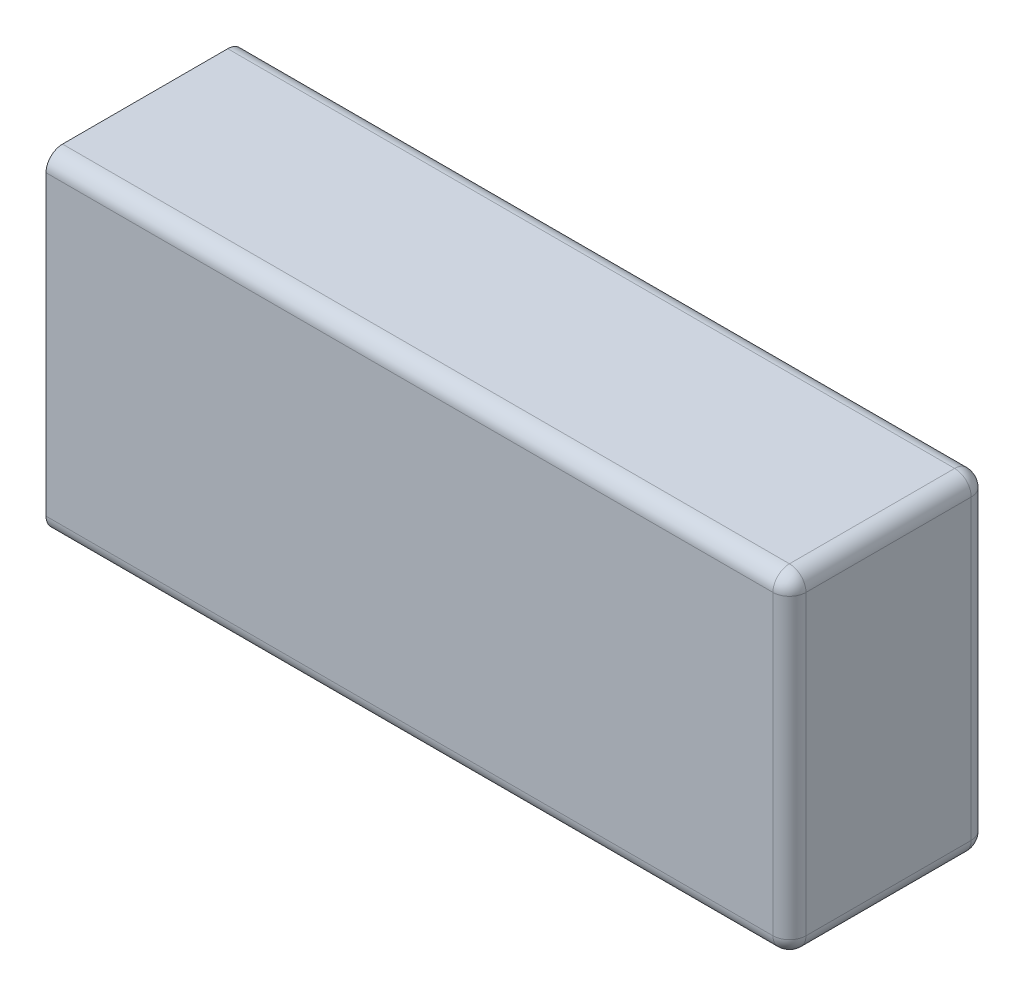
ISO-10303-21;
HEADER;
FILE_DESCRIPTION(('STEP AP214'),'2;1');
FILE_NAME('part.step','',(''),(''),'','','');
FILE_SCHEMA(('AUTOMOTIVE_DESIGN { 1 0 10303 214 1 1 1 1 }'));
ENDSEC;
DATA;
#1=APPLICATION_CONTEXT('core data for automotive mechanical design processes');
#2=APPLICATION_PROTOCOL_DEFINITION('international standard','automotive_design',2000,#1);
#3=PRODUCT_CONTEXT('',#1,'mechanical');
#4=PRODUCT('Part','Part','',(#3));
#5=PRODUCT_RELATED_PRODUCT_CATEGORY('part','',(#4));
#6=PRODUCT_DEFINITION_FORMATION('','',#4);
#7=PRODUCT_DEFINITION_CONTEXT('part definition',#1,'design');
#8=PRODUCT_DEFINITION('design','',#6,#7);
#9=PRODUCT_DEFINITION_SHAPE('','',#8);
#10=(LENGTH_UNIT() NAMED_UNIT(*) SI_UNIT(.MILLI.,.METRE.));
#11=(NAMED_UNIT(*) PLANE_ANGLE_UNIT() SI_UNIT($,.RADIAN.));
#12=(NAMED_UNIT(*) SI_UNIT($,.STERADIAN.) SOLID_ANGLE_UNIT());
#13=UNCERTAINTY_MEASURE_WITH_UNIT(LENGTH_MEASURE(1.E-05),#10,'distance_accuracy_value','');
#14=(GEOMETRIC_REPRESENTATION_CONTEXT(3) GLOBAL_UNCERTAINTY_ASSIGNED_CONTEXT((#13)) GLOBAL_UNIT_ASSIGNED_CONTEXT((#10,
#11,#12)) REPRESENTATION_CONTEXT('',''));
#15=CARTESIAN_POINT('',(0.,0.,0.));
#16=DIRECTION('',(0.,0.,1.));
#17=DIRECTION('',(1.,0.,0.));
#18=AXIS2_PLACEMENT_3D('',#15,#16,#17);
#19=CARTESIAN_POINT('',(45.,9.,5.));
#20=DIRECTION('',(-1.,0.,0.));
#21=DIRECTION('',(0.,0.,1.));
#22=AXIS2_PLACEMENT_3D('',#19,#20,#21);
#23=CYLINDRICAL_SURFACE('',#22,1.);
#24=DIRECTION('',(-1.,0.,0.));
#25=VECTOR('',#24,1.);
#26=CARTESIAN_POINT('',(45.,8.99999999999999,6.));
#27=LINE('',#26,#25);
#28=CARTESIAN_POINT('',(44.,8.99999999999999,6.));
#29=VERTEX_POINT('',#28);
#30=CARTESIAN_POINT('',(0.,8.99999999999999,6.));
#31=VERTEX_POINT('',#30);
#32=EDGE_CURVE('E113',#29,#31,#27,.T.);
#33=ORIENTED_EDGE('',*,*,#32,.F.);
#34=CARTESIAN_POINT('',(44.,9.,5.));
#35=DIRECTION('',(-1.,0.,0.));
#36=DIRECTION('',(0.,0.,1.));
#37=AXIS2_PLACEMENT_3D('',#34,#35,#36);
#38=CIRCLE('',#37,1.);
#39=CARTESIAN_POINT('',(44.,10.,4.99999999999999));
#40=VERTEX_POINT('',#39);
#41=EDGE_CURVE('E123',#29,#40,#38,.T.);
#42=ORIENTED_EDGE('',*,*,#41,.T.);
#43=DIRECTION('',(-1.,0.,0.));
#44=VECTOR('',#43,1.);
#45=CARTESIAN_POINT('',(45.,10.,4.99999999999999));
#46=LINE('',#45,#44);
#47=CARTESIAN_POINT('',(0.,10.,4.99999999999999));
#48=VERTEX_POINT('',#47);
#49=EDGE_CURVE('E136',#40,#48,#46,.T.);
#50=ORIENTED_EDGE('',*,*,#49,.T.);
#51=CARTESIAN_POINT('',(0.,9.,5.));
#52=DIRECTION('',(1.,0.,0.));
#53=DIRECTION('',(0.,0.,1.));
#54=AXIS2_PLACEMENT_3D('',#51,#52,#53);
#55=CIRCLE('',#54,1.);
#56=EDGE_CURVE('E130',#48,#31,#55,.T.);
#57=ORIENTED_EDGE('',*,*,#56,.T.);
#58=EDGE_LOOP('',(#33,#42,#50,#57));
#59=FACE_BOUND('',#58,.T.);
#60=ADVANCED_FACE('F35',(#59),#23,.T.);
#61=CARTESIAN_POINT('',(45.,-8.99999999999999,6.));
#62=DIRECTION('',(0.,0.,-1.));
#63=DIRECTION('',(-1.,0.,0.));
#64=AXIS2_PLACEMENT_3D('',#61,#62,#63);
#65=PLANE('',#64);
#66=DIRECTION('',(-1.,0.,0.));
#67=VECTOR('',#66,1.);
#68=CARTESIAN_POINT('',(45.,-8.99999999999999,6.));
#69=LINE('',#68,#67);
#70=CARTESIAN_POINT('',(44.,-8.99999999999999,6.));
#71=VERTEX_POINT('',#70);
#72=CARTESIAN_POINT('',(0.,-8.99999999999999,6.));
#73=VERTEX_POINT('',#72);
#74=EDGE_CURVE('E124',#71,#73,#69,.T.);
#75=ORIENTED_EDGE('',*,*,#74,.F.);
#76=DIRECTION('',(0.,-1.,0.));
#77=VECTOR('',#76,1.);
#78=CARTESIAN_POINT('',(44.,-8.99999999999999,6.));
#79=LINE('',#78,#77);
#80=EDGE_CURVE('E11',#71,#29,#79,.F.);
#81=ORIENTED_EDGE('',*,*,#80,.T.);
#82=ORIENTED_EDGE('',*,*,#32,.T.);
#83=DIRECTION('',(0.,-1.,0.));
#84=VECTOR('',#83,1.);
#85=CARTESIAN_POINT('',(0.,-8.99999999999999,6.));
#86=LINE('',#85,#84);
#87=EDGE_CURVE('E116',#31,#73,#86,.T.);
#88=ORIENTED_EDGE('',*,*,#87,.T.);
#89=EDGE_LOOP('',(#75,#81,#82,#88));
#90=FACE_BOUND('',#89,.T.);
#91=ADVANCED_FACE('F115',(#90),#65,.F.);
#92=CARTESIAN_POINT('',(45.,-9.,5.));
#93=DIRECTION('',(-1.,0.,0.));
#94=DIRECTION('',(0.,0.,1.));
#95=AXIS2_PLACEMENT_3D('',#92,#93,#94);
#96=CYLINDRICAL_SURFACE('',#95,1.);
#97=DIRECTION('',(-1.,0.,0.));
#98=VECTOR('',#97,1.);
#99=CARTESIAN_POINT('',(45.,-10.,4.99999999999999));
#100=LINE('',#99,#98);
#101=CARTESIAN_POINT('',(44.,-10.,4.99999999999999));
#102=VERTEX_POINT('',#101);
#103=CARTESIAN_POINT('',(0.,-10.,4.99999999999999));
#104=VERTEX_POINT('',#103);
#105=EDGE_CURVE('E166',#102,#104,#100,.T.);
#106=ORIENTED_EDGE('',*,*,#105,.F.);
#107=CARTESIAN_POINT('',(44.,-9.,5.));
#108=DIRECTION('',(-1.,0.,0.));
#109=DIRECTION('',(0.,0.,1.));
#110=AXIS2_PLACEMENT_3D('',#107,#108,#109);
#111=CIRCLE('',#110,1.);
#112=EDGE_CURVE('E44',#102,#71,#111,.T.);
#113=ORIENTED_EDGE('',*,*,#112,.T.);
#114=ORIENTED_EDGE('',*,*,#74,.T.);
#115=CARTESIAN_POINT('',(0.,-9.,5.));
#116=DIRECTION('',(1.,0.,0.));
#117=DIRECTION('',(0.,0.,-1.));
#118=AXIS2_PLACEMENT_3D('',#115,#116,#117);
#119=CIRCLE('',#118,1.);
#120=EDGE_CURVE('E133',#73,#104,#119,.T.);
#121=ORIENTED_EDGE('',*,*,#120,.T.);
#122=EDGE_LOOP('',(#106,#113,#114,#121));
#123=FACE_BOUND('',#122,.T.);
#124=ADVANCED_FACE('F246',(#123),#96,.T.);
#125=CARTESIAN_POINT('',(45.,-10.,4.99999999999999));
#126=DIRECTION('',(0.,1.,0.));
#127=DIRECTION('',(0.,0.,1.));
#128=AXIS2_PLACEMENT_3D('',#125,#126,#127);
#129=PLANE('',#128);
#130=DIRECTION('',(-1.,0.,0.));
#131=VECTOR('',#130,1.);
#132=CARTESIAN_POINT('',(45.,-10.,-4.99999999999999));
#133=LINE('',#132,#131);
#134=CARTESIAN_POINT('',(44.,-10.,-4.99999999999999));
#135=VERTEX_POINT('',#134);
#136=CARTESIAN_POINT('',(0.,-10.,-4.99999999999999));
#137=VERTEX_POINT('',#136);
#138=EDGE_CURVE('E164',#135,#137,#133,.T.);
#139=ORIENTED_EDGE('',*,*,#138,.F.);
#140=DIRECTION('',(0.,0.,-1.));
#141=VECTOR('',#140,1.);
#142=CARTESIAN_POINT('',(44.,-10.,4.99999999999999));
#143=LINE('',#142,#141);
#144=EDGE_CURVE('E59',#135,#102,#143,.F.);
#145=ORIENTED_EDGE('',*,*,#144,.T.);
#146=ORIENTED_EDGE('',*,*,#105,.T.);
#147=DIRECTION('',(0.,0.,-1.));
#148=VECTOR('',#147,1.);
#149=CARTESIAN_POINT('',(0.,-10.,4.99999999999999));
#150=LINE('',#149,#148);
#151=EDGE_CURVE('E143',#104,#137,#150,.T.);
#152=ORIENTED_EDGE('',*,*,#151,.T.);
#153=EDGE_LOOP('',(#139,#145,#146,#152));
#154=FACE_BOUND('',#153,.T.);
#155=ADVANCED_FACE('F349',(#154),#129,.F.);
#156=CARTESIAN_POINT('',(45.,-9.,-5.));
#157=DIRECTION('',(-1.,0.,0.));
#158=DIRECTION('',(0.,0.,1.));
#159=AXIS2_PLACEMENT_3D('',#156,#157,#158);
#160=CYLINDRICAL_SURFACE('',#159,1.);
#161=DIRECTION('',(-1.,0.,0.));
#162=VECTOR('',#161,1.);
#163=CARTESIAN_POINT('',(45.,-8.99999999999999,-6.));
#164=LINE('',#163,#162);
#165=CARTESIAN_POINT('',(44.,-8.99999999999999,-6.));
#166=VERTEX_POINT('',#165);
#167=CARTESIAN_POINT('',(0.,-8.99999999999999,-6.));
#168=VERTEX_POINT('',#167);
#169=EDGE_CURVE('E162',#166,#168,#164,.T.);
#170=ORIENTED_EDGE('',*,*,#169,.F.);
#171=CARTESIAN_POINT('',(44.,-9.,-5.));
#172=DIRECTION('',(-1.,0.,0.));
#173=DIRECTION('',(0.,0.,1.));
#174=AXIS2_PLACEMENT_3D('',#171,#172,#173);
#175=CIRCLE('',#174,1.);
#176=EDGE_CURVE('E185',#166,#135,#175,.T.);
#177=ORIENTED_EDGE('',*,*,#176,.T.);
#178=ORIENTED_EDGE('',*,*,#138,.T.);
#179=CARTESIAN_POINT('',(0.,-9.,-5.));
#180=DIRECTION('',(1.,0.,0.));
#181=DIRECTION('',(0.,0.,1.));
#182=AXIS2_PLACEMENT_3D('',#179,#180,#181);
#183=CIRCLE('',#182,1.);
#184=EDGE_CURVE('E146',#137,#168,#183,.T.);
#185=ORIENTED_EDGE('',*,*,#184,.T.);
#186=EDGE_LOOP('',(#170,#177,#178,#185));
#187=FACE_BOUND('',#186,.T.);
#188=ADVANCED_FACE('F340',(#187),#160,.T.);
#189=CARTESIAN_POINT('',(45.,-8.99999999999999,-6.));
#190=DIRECTION('',(0.,0.,1.));
#191=DIRECTION('',(1.,0.,0.));
#192=AXIS2_PLACEMENT_3D('',#189,#190,#191);
#193=PLANE('',#192);
#194=DIRECTION('',(-1.,0.,0.));
#195=VECTOR('',#194,1.);
#196=CARTESIAN_POINT('',(45.,8.99999999999999,-6.));
#197=LINE('',#196,#195);
#198=CARTESIAN_POINT('',(44.,8.99999999999999,-6.));
#199=VERTEX_POINT('',#198);
#200=CARTESIAN_POINT('',(0.,8.99999999999999,-6.));
#201=VERTEX_POINT('',#200);
#202=EDGE_CURVE('E160',#199,#201,#197,.T.);
#203=ORIENTED_EDGE('',*,*,#202,.F.);
#204=DIRECTION('',(0.,1.,0.));
#205=VECTOR('',#204,1.);
#206=CARTESIAN_POINT('',(44.,-8.99999999999999,-6.));
#207=LINE('',#206,#205);
#208=EDGE_CURVE('E183',#199,#166,#207,.F.);
#209=ORIENTED_EDGE('',*,*,#208,.T.);
#210=ORIENTED_EDGE('',*,*,#169,.T.);
#211=DIRECTION('',(0.,1.,0.));
#212=VECTOR('',#211,1.);
#213=CARTESIAN_POINT('',(0.,-8.99999999999999,-6.));
#214=LINE('',#213,#212);
#215=EDGE_CURVE('E149',#168,#201,#214,.T.);
#216=ORIENTED_EDGE('',*,*,#215,.T.);
#217=EDGE_LOOP('',(#203,#209,#210,#216));
#218=FACE_BOUND('',#217,.T.);
#219=ADVANCED_FACE('F331',(#218),#193,.F.);
#220=CARTESIAN_POINT('',(45.,9.,-5.));
#221=DIRECTION('',(-1.,0.,0.));
#222=DIRECTION('',(0.,0.,1.));
#223=AXIS2_PLACEMENT_3D('',#220,#221,#222);
#224=CYLINDRICAL_SURFACE('',#223,1.);
#225=DIRECTION('',(-1.,0.,0.));
#226=VECTOR('',#225,1.);
#227=CARTESIAN_POINT('',(45.,10.,-4.99999999999999));
#228=LINE('',#227,#226);
#229=CARTESIAN_POINT('',(44.,10.,-4.99999999999999));
#230=VERTEX_POINT('',#229);
#231=CARTESIAN_POINT('',(0.,10.,-4.99999999999999));
#232=VERTEX_POINT('',#231);
#233=EDGE_CURVE('E158',#230,#232,#228,.T.);
#234=ORIENTED_EDGE('',*,*,#233,.F.);
#235=CARTESIAN_POINT('',(44.,9.,-5.));
#236=DIRECTION('',(-1.,0.,0.));
#237=DIRECTION('',(0.,0.,1.));
#238=AXIS2_PLACEMENT_3D('',#235,#236,#237);
#239=CIRCLE('',#238,1.);
#240=EDGE_CURVE('E181',#230,#199,#239,.T.);
#241=ORIENTED_EDGE('',*,*,#240,.T.);
#242=ORIENTED_EDGE('',*,*,#202,.T.);
#243=CARTESIAN_POINT('',(0.,9.,-5.));
#244=DIRECTION('',(1.,0.,0.));
#245=DIRECTION('',(0.,0.,-1.));
#246=AXIS2_PLACEMENT_3D('',#243,#244,#245);
#247=CIRCLE('',#246,1.);
#248=EDGE_CURVE('E152',#201,#232,#247,.T.);
#249=ORIENTED_EDGE('',*,*,#248,.T.);
#250=EDGE_LOOP('',(#234,#241,#242,#249));
#251=FACE_BOUND('',#250,.T.);
#252=ADVANCED_FACE('F322',(#251),#224,.T.);
#253=CARTESIAN_POINT('',(45.,10.,4.99999999999999));
#254=DIRECTION('',(0.,-1.,0.));
#255=DIRECTION('',(0.,0.,-1.));
#256=AXIS2_PLACEMENT_3D('',#253,#254,#255);
#257=PLANE('',#256);
#258=ORIENTED_EDGE('',*,*,#49,.F.);
#259=DIRECTION('',(0.,0.,1.));
#260=VECTOR('',#259,1.);
#261=CARTESIAN_POINT('',(44.,10.,4.99999999999999));
#262=LINE('',#261,#260);
#263=EDGE_CURVE('E179',#40,#230,#262,.F.);
#264=ORIENTED_EDGE('',*,*,#263,.T.);
#265=ORIENTED_EDGE('',*,*,#233,.T.);
#266=DIRECTION('',(0.,0.,1.));
#267=VECTOR('',#266,1.);
#268=CARTESIAN_POINT('',(0.,10.,4.99999999999999));
#269=LINE('',#268,#267);
#270=EDGE_CURVE('E155',#232,#48,#269,.T.);
#271=ORIENTED_EDGE('',*,*,#270,.T.);
#272=EDGE_LOOP('',(#258,#264,#265,#271));
#273=FACE_BOUND('',#272,.T.);
#274=ADVANCED_FACE('F314',(#273),#257,.F.);
#275=CARTESIAN_POINT('',(45.,9.,5.));
#276=DIRECTION('',(-1.,0.,0.));
#277=DIRECTION('',(0.,0.,1.));
#278=AXIS2_PLACEMENT_3D('',#275,#276,#277);
#279=PLANE('',#278);
#280=DIRECTION('',(0.,1.,0.));
#281=VECTOR('',#280,1.);
#282=CARTESIAN_POINT('',(45.,9.,-5.));
#283=LINE('',#282,#281);
#284=CARTESIAN_POINT('',(45.,-9.,-5.));
#285=VERTEX_POINT('',#284);
#286=CARTESIAN_POINT('',(45.,9.,-5.));
#287=VERTEX_POINT('',#286);
#288=EDGE_CURVE('E174',#285,#287,#283,.T.);
#289=ORIENTED_EDGE('',*,*,#288,.T.);
#290=DIRECTION('',(0.,0.,1.));
#291=VECTOR('',#290,1.);
#292=CARTESIAN_POINT('',(45.,9.,5.));
#293=LINE('',#292,#291);
#294=CARTESIAN_POINT('',(45.,9.,5.));
#295=VERTEX_POINT('',#294);
#296=EDGE_CURVE('E176',#287,#295,#293,.T.);
#297=ORIENTED_EDGE('',*,*,#296,.T.);
#298=DIRECTION('',(0.,-1.,0.));
#299=VECTOR('',#298,1.);
#300=CARTESIAN_POINT('',(45.,9.,5.));
#301=LINE('',#300,#299);
#302=CARTESIAN_POINT('',(45.,-9.,5.));
#303=VERTEX_POINT('',#302);
#304=EDGE_CURVE('E170',#295,#303,#301,.T.);
#305=ORIENTED_EDGE('',*,*,#304,.T.);
#306=DIRECTION('',(0.,0.,-1.));
#307=VECTOR('',#306,1.);
#308=CARTESIAN_POINT('',(45.,-9.,5.));
#309=LINE('',#308,#307);
#310=EDGE_CURVE('E172',#303,#285,#309,.T.);
#311=ORIENTED_EDGE('',*,*,#310,.T.);
#312=EDGE_LOOP('',(#289,#297,#305,#311));
#313=FACE_BOUND('',#312,.T.);
#314=ADVANCED_FACE('F220',(#313),#279,.F.);
#315=CARTESIAN_POINT('',(0.,9.,5.));
#316=DIRECTION('',(-1.,0.,0.));
#317=DIRECTION('',(0.,0.,1.));
#318=AXIS2_PLACEMENT_3D('',#315,#316,#317);
#319=PLANE('',#318);
#320=ORIENTED_EDGE('',*,*,#56,.F.);
#321=ORIENTED_EDGE('',*,*,#270,.F.);
#322=ORIENTED_EDGE('',*,*,#248,.F.);
#323=ORIENTED_EDGE('',*,*,#215,.F.);
#324=ORIENTED_EDGE('',*,*,#184,.F.);
#325=ORIENTED_EDGE('',*,*,#151,.F.);
#326=ORIENTED_EDGE('',*,*,#120,.F.);
#327=ORIENTED_EDGE('',*,*,#87,.F.);
#328=EDGE_LOOP('',(#320,#321,#322,#323,#324,#325,#326,#327));
#329=FACE_BOUND('',#328,.T.);
#330=ADVANCED_FACE('F128',(#329),#319,.T.);
#331=CARTESIAN_POINT('',(44.,-9.,-5.));
#332=DIRECTION('',(-1.,0.,0.));
#333=DIRECTION('',(0.,0.,1.));
#334=AXIS2_PLACEMENT_3D('',#331,#332,#333);
#335=SPHERICAL_SURFACE('',#334,1.);
#336=CARTESIAN_POINT('',(44.,-9.,-5.));
#337=DIRECTION('',(0.,0.,1.));
#338=DIRECTION('',(0.,-1.,0.));
#339=AXIS2_PLACEMENT_3D('',#336,#337,#338);
#340=CIRCLE('',#339,1.);
#341=EDGE_CURVE('E140',#135,#285,#340,.T.);
#342=ORIENTED_EDGE('',*,*,#341,.F.);
#343=ORIENTED_EDGE('',*,*,#176,.F.);
#344=CARTESIAN_POINT('',(44.,-9.,-5.));
#345=DIRECTION('',(0.,1.,0.));
#346=DIRECTION('',(0.,0.,1.));
#347=AXIS2_PLACEMENT_3D('',#344,#345,#346);
#348=CIRCLE('',#347,1.);
#349=EDGE_CURVE('E39',#285,#166,#348,.T.);
#350=ORIENTED_EDGE('',*,*,#349,.F.);
#351=EDGE_LOOP('',(#342,#343,#350));
#352=FACE_BOUND('',#351,.T.);
#353=ADVANCED_FACE('F37',(#352),#335,.T.);
#354=CARTESIAN_POINT('',(44.,9.,-5.));
#355=DIRECTION('',(0.,1.,0.));
#356=DIRECTION('',(0.,0.,1.));
#357=AXIS2_PLACEMENT_3D('',#354,#355,#356);
#358=CYLINDRICAL_SURFACE('',#357,1.);
#359=ORIENTED_EDGE('',*,*,#349,.T.);
#360=ORIENTED_EDGE('',*,*,#208,.F.);
#361=CARTESIAN_POINT('',(44.,9.,-5.));
#362=DIRECTION('',(0.,1.,0.));
#363=DIRECTION('',(0.,0.,1.));
#364=AXIS2_PLACEMENT_3D('',#361,#362,#363);
#365=CIRCLE('',#364,1.);
#366=EDGE_CURVE('E202',#287,#199,#365,.T.);
#367=ORIENTED_EDGE('',*,*,#366,.F.);
#368=ORIENTED_EDGE('',*,*,#288,.F.);
#369=EDGE_LOOP('',(#359,#360,#367,#368));
#370=FACE_BOUND('',#369,.T.);
#371=ADVANCED_FACE('F217',(#370),#358,.T.);
#372=CARTESIAN_POINT('',(44.,-9.,5.));
#373=DIRECTION('',(0.,0.,-1.));
#374=DIRECTION('',(-1.,0.,0.));
#375=AXIS2_PLACEMENT_3D('',#372,#373,#374);
#376=CYLINDRICAL_SURFACE('',#375,1.);
#377=ORIENTED_EDGE('',*,*,#341,.T.);
#378=ORIENTED_EDGE('',*,*,#310,.F.);
#379=CARTESIAN_POINT('',(44.,-9.,4.99999999999999));
#380=DIRECTION('',(0.,0.,1.));
#381=DIRECTION('',(1.,0.,0.));
#382=AXIS2_PLACEMENT_3D('',#379,#380,#381);
#383=CIRCLE('',#382,1.);
#384=EDGE_CURVE('E199',#102,#303,#383,.T.);
#385=ORIENTED_EDGE('',*,*,#384,.F.);
#386=ORIENTED_EDGE('',*,*,#144,.F.);
#387=EDGE_LOOP('',(#377,#378,#385,#386));
#388=FACE_BOUND('',#387,.T.);
#389=ADVANCED_FACE('F209',(#388),#376,.T.);
#390=CARTESIAN_POINT('',(44.,9.,-5.));
#391=DIRECTION('',(-1.,0.,0.));
#392=DIRECTION('',(0.,0.,1.));
#393=AXIS2_PLACEMENT_3D('',#390,#391,#392);
#394=SPHERICAL_SURFACE('',#393,1.);
#395=ORIENTED_EDGE('',*,*,#366,.T.);
#396=ORIENTED_EDGE('',*,*,#240,.F.);
#397=CARTESIAN_POINT('',(44.,9.,-5.));
#398=DIRECTION('',(0.,0.,1.));
#399=DIRECTION('',(0.,-1.,0.));
#400=AXIS2_PLACEMENT_3D('',#397,#398,#399);
#401=CIRCLE('',#400,1.);
#402=EDGE_CURVE('E196',#287,#230,#401,.T.);
#403=ORIENTED_EDGE('',*,*,#402,.F.);
#404=EDGE_LOOP('',(#395,#396,#403));
#405=FACE_BOUND('',#404,.T.);
#406=ADVANCED_FACE('F231',(#405),#394,.T.);
#407=CARTESIAN_POINT('',(44.,-9.,5.));
#408=DIRECTION('',(-1.,0.,0.));
#409=DIRECTION('',(0.,0.,1.));
#410=AXIS2_PLACEMENT_3D('',#407,#408,#409);
#411=SPHERICAL_SURFACE('',#410,1.);
#412=ORIENTED_EDGE('',*,*,#112,.F.);
#413=ORIENTED_EDGE('',*,*,#384,.T.);
#414=CARTESIAN_POINT('',(44.,-9.,5.));
#415=DIRECTION('',(0.,1.,0.));
#416=DIRECTION('',(0.,0.,1.));
#417=AXIS2_PLACEMENT_3D('',#414,#415,#416);
#418=CIRCLE('',#417,1.);
#419=EDGE_CURVE('E193',#71,#303,#418,.T.);
#420=ORIENTED_EDGE('',*,*,#419,.F.);
#421=EDGE_LOOP('',(#412,#413,#420));
#422=FACE_BOUND('',#421,.T.);
#423=ADVANCED_FACE('F228',(#422),#411,.T.);
#424=CARTESIAN_POINT('',(44.,9.,5.));
#425=DIRECTION('',(0.,0.,1.));
#426=DIRECTION('',(1.,0.,0.));
#427=AXIS2_PLACEMENT_3D('',#424,#425,#426);
#428=CYLINDRICAL_SURFACE('',#427,1.);
#429=ORIENTED_EDGE('',*,*,#402,.T.);
#430=ORIENTED_EDGE('',*,*,#263,.F.);
#431=CARTESIAN_POINT('',(44.,9.,5.));
#432=DIRECTION('',(0.,0.,1.));
#433=DIRECTION('',(0.,-1.,0.));
#434=AXIS2_PLACEMENT_3D('',#431,#432,#433);
#435=CIRCLE('',#434,1.);
#436=EDGE_CURVE('E191',#295,#40,#435,.T.);
#437=ORIENTED_EDGE('',*,*,#436,.F.);
#438=ORIENTED_EDGE('',*,*,#296,.F.);
#439=EDGE_LOOP('',(#429,#430,#437,#438));
#440=FACE_BOUND('',#439,.T.);
#441=ADVANCED_FACE('F230',(#440),#428,.T.);
#442=CARTESIAN_POINT('',(44.,9.,5.));
#443=DIRECTION('',(0.,-1.,0.));
#444=DIRECTION('',(0.,0.,-1.));
#445=AXIS2_PLACEMENT_3D('',#442,#443,#444);
#446=CYLINDRICAL_SURFACE('',#445,1.);
#447=ORIENTED_EDGE('',*,*,#419,.T.);
#448=ORIENTED_EDGE('',*,*,#304,.F.);
#449=CARTESIAN_POINT('',(44.,8.99999999999999,5.));
#450=DIRECTION('',(0.,1.,0.));
#451=DIRECTION('',(-1.,0.,0.));
#452=AXIS2_PLACEMENT_3D('',#449,#450,#451);
#453=CIRCLE('',#452,1.);
#454=EDGE_CURVE('E189',#29,#295,#453,.T.);
#455=ORIENTED_EDGE('',*,*,#454,.F.);
#456=ORIENTED_EDGE('',*,*,#80,.F.);
#457=EDGE_LOOP('',(#447,#448,#455,#456));
#458=FACE_BOUND('',#457,.T.);
#459=ADVANCED_FACE('F225',(#458),#446,.T.);
#460=CARTESIAN_POINT('',(44.,9.,5.));
#461=DIRECTION('',(-1.,0.,0.));
#462=DIRECTION('',(0.,0.,1.));
#463=AXIS2_PLACEMENT_3D('',#460,#461,#462);
#464=SPHERICAL_SURFACE('',#463,1.);
#465=ORIENTED_EDGE('',*,*,#436,.T.);
#466=ORIENTED_EDGE('',*,*,#41,.F.);
#467=ORIENTED_EDGE('',*,*,#454,.T.);
#468=EDGE_LOOP('',(#465,#466,#467));
#469=FACE_BOUND('',#468,.T.);
#470=ADVANCED_FACE('F250',(#469),#464,.T.);
#471=CLOSED_SHELL('',(#60,#91,#124,#155,#188,#219,#252,#274,#314,#330,#353,#371,#389,#406,#423,
#441,#459,#470));
#472=MANIFOLD_SOLID_BREP('B2',#471);
#473=ADVANCED_BREP_SHAPE_REPRESENTATION('',(#18,#472),#14);
#474=SHAPE_DEFINITION_REPRESENTATION(#9,#473);
ENDSEC;
END-ISO-10303-21;
